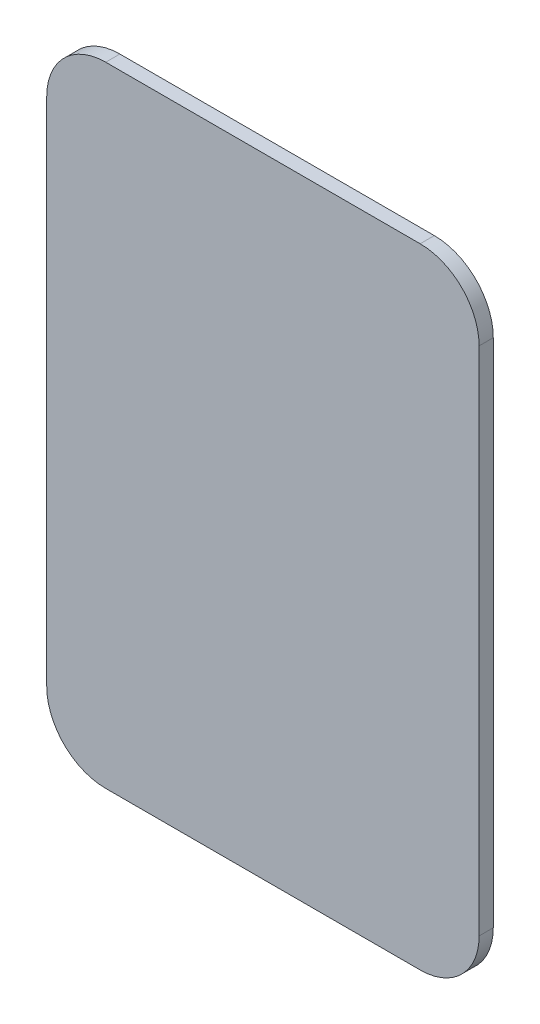
ISO-10303-21;
HEADER;
FILE_DESCRIPTION(('STEP AP214'),'2;1');
FILE_NAME('part.step','',(''),(''),'','','');
FILE_SCHEMA(('AUTOMOTIVE_DESIGN { 1 0 10303 214 1 1 1 1 }'));
ENDSEC;
DATA;
#1=APPLICATION_CONTEXT('core data for automotive mechanical design processes');
#2=APPLICATION_PROTOCOL_DEFINITION('international standard','automotive_design',2000,#1);
#3=PRODUCT_CONTEXT('',#1,'mechanical');
#4=PRODUCT('Part','Part','',(#3));
#5=PRODUCT_RELATED_PRODUCT_CATEGORY('part','',(#4));
#6=PRODUCT_DEFINITION_FORMATION('','',#4);
#7=PRODUCT_DEFINITION_CONTEXT('part definition',#1,'design');
#8=PRODUCT_DEFINITION('design','',#6,#7);
#9=PRODUCT_DEFINITION_SHAPE('','',#8);
#10=(LENGTH_UNIT() NAMED_UNIT(*) SI_UNIT(.MILLI.,.METRE.));
#11=(NAMED_UNIT(*) PLANE_ANGLE_UNIT() SI_UNIT($,.RADIAN.));
#12=(NAMED_UNIT(*) SI_UNIT($,.STERADIAN.) SOLID_ANGLE_UNIT());
#13=UNCERTAINTY_MEASURE_WITH_UNIT(LENGTH_MEASURE(1.E-05),#10,'distance_accuracy_value','');
#14=(GEOMETRIC_REPRESENTATION_CONTEXT(3) GLOBAL_UNCERTAINTY_ASSIGNED_CONTEXT((#13)) GLOBAL_UNIT_ASSIGNED_CONTEXT((#10,
#11,#12)) REPRESENTATION_CONTEXT('',''));
#15=CARTESIAN_POINT('',(0.,0.,0.));
#16=DIRECTION('',(0.,0.,1.));
#17=DIRECTION('',(1.,0.,0.));
#18=AXIS2_PLACEMENT_3D('',#15,#16,#17);
#19=CARTESIAN_POINT('',(177.8,889.,18.288));
#20=DIRECTION('',(0.,0.,-1.));
#21=DIRECTION('',(-1.,0.,0.));
#22=AXIS2_PLACEMENT_3D('',#19,#20,#21);
#23=CYLINDRICAL_SURFACE('',#22,76.2000000000001);
#24=CARTESIAN_POINT('',(177.8,889.,0.));
#25=DIRECTION('',(0.,0.,1.));
#26=DIRECTION('',(1.,0.,0.));
#27=AXIS2_PLACEMENT_3D('',#24,#25,#26);
#28=CIRCLE('',#27,76.2000000000001);
#29=CARTESIAN_POINT('',(101.6,889.,0.));
#30=VERTEX_POINT('',#29);
#31=CARTESIAN_POINT('',(177.8,812.8,0.));
#32=VERTEX_POINT('',#31);
#33=EDGE_CURVE('E128',#30,#32,#28,.T.);
#34=ORIENTED_EDGE('',*,*,#33,.T.);
#35=DIRECTION('',(0.,0.,-1.));
#36=VECTOR('',#35,1.);
#37=CARTESIAN_POINT('',(177.8,812.8,18.288));
#38=LINE('',#37,#36);
#39=CARTESIAN_POINT('',(177.8,812.8,18.288));
#40=VERTEX_POINT('',#39);
#41=EDGE_CURVE('E11',#40,#32,#38,.T.);
#42=ORIENTED_EDGE('',*,*,#41,.F.);
#43=CARTESIAN_POINT('',(177.8,889.,18.288));
#44=DIRECTION('',(0.,0.,1.));
#45=DIRECTION('',(1.,0.,0.));
#46=AXIS2_PLACEMENT_3D('',#43,#44,#45);
#47=CIRCLE('',#46,76.2000000000001);
#48=CARTESIAN_POINT('',(101.6,889.,18.288));
#49=VERTEX_POINT('',#48);
#50=EDGE_CURVE('E142',#49,#40,#47,.T.);
#51=ORIENTED_EDGE('',*,*,#50,.F.);
#52=DIRECTION('',(0.,0.,-1.));
#53=VECTOR('',#52,1.);
#54=CARTESIAN_POINT('',(101.6,889.,18.288));
#55=LINE('',#54,#53);
#56=EDGE_CURVE('E124',#49,#30,#55,.T.);
#57=ORIENTED_EDGE('',*,*,#56,.T.);
#58=EDGE_LOOP('',(#34,#42,#51,#57));
#59=FACE_BOUND('',#58,.T.);
#60=ADVANCED_FACE('F32',(#59),#23,.T.);
#61=CARTESIAN_POINT('',(177.8,812.8,18.288));
#62=DIRECTION('',(0.,1.,0.));
#63=DIRECTION('',(0.,0.,1.));
#64=AXIS2_PLACEMENT_3D('',#61,#62,#63);
#65=PLANE('',#64);
#66=DIRECTION('',(1.,0.,0.));
#67=VECTOR('',#66,1.);
#68=CARTESIAN_POINT('',(177.8,812.8,0.));
#69=LINE('',#68,#67);
#70=CARTESIAN_POINT('',(584.2,812.8,0.));
#71=VERTEX_POINT('',#70);
#72=EDGE_CURVE('E131',#32,#71,#69,.T.);
#73=ORIENTED_EDGE('',*,*,#72,.T.);
#74=DIRECTION('',(0.,0.,-1.));
#75=VECTOR('',#74,1.);
#76=CARTESIAN_POINT('',(584.2,812.8,18.288));
#77=LINE('',#76,#75);
#78=CARTESIAN_POINT('',(584.2,812.8,18.288));
#79=VERTEX_POINT('',#78);
#80=EDGE_CURVE('E40',#79,#71,#77,.T.);
#81=ORIENTED_EDGE('',*,*,#80,.F.);
#82=DIRECTION('',(1.,0.,0.));
#83=VECTOR('',#82,1.);
#84=CARTESIAN_POINT('',(177.8,812.8,18.288));
#85=LINE('',#84,#83);
#86=EDGE_CURVE('E91',#40,#79,#85,.T.);
#87=ORIENTED_EDGE('',*,*,#86,.F.);
#88=ORIENTED_EDGE('',*,*,#41,.T.);
#89=EDGE_LOOP('',(#73,#81,#87,#88));
#90=FACE_BOUND('',#89,.T.);
#91=ADVANCED_FACE('F177',(#90),#65,.F.);
#92=CARTESIAN_POINT('',(584.2,889.,18.288));
#93=DIRECTION('',(0.,0.,-1.));
#94=DIRECTION('',(-1.,0.,0.));
#95=AXIS2_PLACEMENT_3D('',#92,#93,#94);
#96=CYLINDRICAL_SURFACE('',#95,76.1999999999998);
#97=CARTESIAN_POINT('',(584.2,889.,0.));
#98=DIRECTION('',(0.,0.,1.));
#99=DIRECTION('',(1.,0.,0.));
#100=AXIS2_PLACEMENT_3D('',#97,#98,#99);
#101=CIRCLE('',#100,76.1999999999998);
#102=CARTESIAN_POINT('',(660.4,889.,0.));
#103=VERTEX_POINT('',#102);
#104=EDGE_CURVE('E133',#71,#103,#101,.T.);
#105=ORIENTED_EDGE('',*,*,#104,.T.);
#106=DIRECTION('',(0.,0.,-1.));
#107=VECTOR('',#106,1.);
#108=CARTESIAN_POINT('',(660.4,889.,18.288));
#109=LINE('',#108,#107);
#110=CARTESIAN_POINT('',(660.4,889.,18.288));
#111=VERTEX_POINT('',#110);
#112=EDGE_CURVE('E149',#111,#103,#109,.T.);
#113=ORIENTED_EDGE('',*,*,#112,.F.);
#114=CARTESIAN_POINT('',(584.2,889.,18.288));
#115=DIRECTION('',(0.,0.,1.));
#116=DIRECTION('',(1.,0.,0.));
#117=AXIS2_PLACEMENT_3D('',#114,#115,#116);
#118=CIRCLE('',#117,76.1999999999998);
#119=EDGE_CURVE('E157',#79,#111,#118,.T.);
#120=ORIENTED_EDGE('',*,*,#119,.F.);
#121=ORIENTED_EDGE('',*,*,#80,.T.);
#122=EDGE_LOOP('',(#105,#113,#120,#121));
#123=FACE_BOUND('',#122,.T.);
#124=ADVANCED_FACE('F155',(#123),#96,.T.);
#125=CARTESIAN_POINT('',(660.4,889.,18.288));
#126=DIRECTION('',(-1.,0.,0.));
#127=DIRECTION('',(0.,0.,1.));
#128=AXIS2_PLACEMENT_3D('',#125,#126,#127);
#129=PLANE('',#128);
#130=DIRECTION('',(0.,1.,0.));
#131=VECTOR('',#130,1.);
#132=CARTESIAN_POINT('',(660.4,889.,0.));
#133=LINE('',#132,#131);
#134=CARTESIAN_POINT('',(660.4,1549.4,0.));
#135=VERTEX_POINT('',#134);
#136=EDGE_CURVE('E135',#103,#135,#133,.T.);
#137=ORIENTED_EDGE('',*,*,#136,.T.);
#138=DIRECTION('',(0.,0.,-1.));
#139=VECTOR('',#138,1.);
#140=CARTESIAN_POINT('',(660.4,1549.4,18.288));
#141=LINE('',#140,#139);
#142=CARTESIAN_POINT('',(660.4,1549.4,18.288));
#143=VERTEX_POINT('',#142);
#144=EDGE_CURVE('E146',#143,#135,#141,.T.);
#145=ORIENTED_EDGE('',*,*,#144,.F.);
#146=DIRECTION('',(0.,1.,0.));
#147=VECTOR('',#146,1.);
#148=CARTESIAN_POINT('',(660.4,889.,18.288));
#149=LINE('',#148,#147);
#150=EDGE_CURVE('E169',#111,#143,#149,.T.);
#151=ORIENTED_EDGE('',*,*,#150,.F.);
#152=ORIENTED_EDGE('',*,*,#112,.T.);
#153=EDGE_LOOP('',(#137,#145,#151,#152));
#154=FACE_BOUND('',#153,.T.);
#155=ADVANCED_FACE('F165',(#154),#129,.F.);
#156=CARTESIAN_POINT('',(584.199999999999,1549.4,18.288));
#157=DIRECTION('',(0.,0.,-1.));
#158=DIRECTION('',(-1.,0.,0.));
#159=AXIS2_PLACEMENT_3D('',#156,#157,#158);
#160=CYLINDRICAL_SURFACE('',#159,76.2000000000005);
#161=CARTESIAN_POINT('',(584.199999999999,1549.4,0.));
#162=DIRECTION('',(0.,0.,1.));
#163=DIRECTION('',(1.,0.,0.));
#164=AXIS2_PLACEMENT_3D('',#161,#162,#163);
#165=CIRCLE('',#164,76.2000000000005);
#166=CARTESIAN_POINT('',(584.2,1625.6,0.));
#167=VERTEX_POINT('',#166);
#168=EDGE_CURVE('E137',#135,#167,#165,.T.);
#169=ORIENTED_EDGE('',*,*,#168,.T.);
#170=DIRECTION('',(0.,0.,-1.));
#171=VECTOR('',#170,1.);
#172=CARTESIAN_POINT('',(584.2,1625.6,18.288));
#173=LINE('',#172,#171);
#174=CARTESIAN_POINT('',(584.2,1625.6,18.288));
#175=VERTEX_POINT('',#174);
#176=EDGE_CURVE('E119',#175,#167,#173,.T.);
#177=ORIENTED_EDGE('',*,*,#176,.F.);
#178=CARTESIAN_POINT('',(584.199999999999,1549.4,18.288));
#179=DIRECTION('',(0.,0.,1.));
#180=DIRECTION('',(1.,0.,0.));
#181=AXIS2_PLACEMENT_3D('',#178,#179,#180);
#182=CIRCLE('',#181,76.2000000000005);
#183=EDGE_CURVE('E110',#143,#175,#182,.T.);
#184=ORIENTED_EDGE('',*,*,#183,.F.);
#185=ORIENTED_EDGE('',*,*,#144,.T.);
#186=EDGE_LOOP('',(#169,#177,#184,#185));
#187=FACE_BOUND('',#186,.T.);
#188=ADVANCED_FACE('F168',(#187),#160,.T.);
#189=CARTESIAN_POINT('',(584.2,1625.6,18.288));
#190=DIRECTION('',(0.,-1.,0.));
#191=DIRECTION('',(0.,0.,-1.));
#192=AXIS2_PLACEMENT_3D('',#189,#190,#191);
#193=PLANE('',#192);
#194=DIRECTION('',(-1.,0.,0.));
#195=VECTOR('',#194,1.);
#196=CARTESIAN_POINT('',(584.2,1625.6,0.));
#197=LINE('',#196,#195);
#198=CARTESIAN_POINT('',(177.8,1625.6,0.));
#199=VERTEX_POINT('',#198);
#200=EDGE_CURVE('E118',#167,#199,#197,.T.);
#201=ORIENTED_EDGE('',*,*,#200,.T.);
#202=DIRECTION('',(0.,0.,-1.));
#203=VECTOR('',#202,1.);
#204=CARTESIAN_POINT('',(177.8,1625.6,18.288));
#205=LINE('',#204,#203);
#206=CARTESIAN_POINT('',(177.8,1625.6,18.288));
#207=VERTEX_POINT('',#206);
#208=EDGE_CURVE('E115',#207,#199,#205,.T.);
#209=ORIENTED_EDGE('',*,*,#208,.F.);
#210=DIRECTION('',(-1.,0.,0.));
#211=VECTOR('',#210,1.);
#212=CARTESIAN_POINT('',(584.2,1625.6,18.288));
#213=LINE('',#212,#211);
#214=EDGE_CURVE('E104',#175,#207,#213,.T.);
#215=ORIENTED_EDGE('',*,*,#214,.F.);
#216=ORIENTED_EDGE('',*,*,#176,.T.);
#217=EDGE_LOOP('',(#201,#209,#215,#216));
#218=FACE_BOUND('',#217,.T.);
#219=ADVANCED_FACE('F116',(#218),#193,.F.);
#220=CARTESIAN_POINT('',(177.800000000001,1549.4,18.288));
#221=DIRECTION('',(0.,0.,-1.));
#222=DIRECTION('',(-1.,0.,0.));
#223=AXIS2_PLACEMENT_3D('',#220,#221,#222);
#224=CYLINDRICAL_SURFACE('',#223,76.2000000000007);
#225=CARTESIAN_POINT('',(177.800000000001,1549.4,0.));
#226=DIRECTION('',(0.,0.,1.));
#227=DIRECTION('',(1.,0.,0.));
#228=AXIS2_PLACEMENT_3D('',#225,#226,#227);
#229=CIRCLE('',#228,76.2000000000007);
#230=CARTESIAN_POINT('',(101.6,1549.4,0.));
#231=VERTEX_POINT('',#230);
#232=EDGE_CURVE('E77',#199,#231,#229,.T.);
#233=ORIENTED_EDGE('',*,*,#232,.T.);
#234=DIRECTION('',(0.,0.,-1.));
#235=VECTOR('',#234,1.);
#236=CARTESIAN_POINT('',(101.6,1549.4,18.288));
#237=LINE('',#236,#235);
#238=CARTESIAN_POINT('',(101.6,1549.4,18.288));
#239=VERTEX_POINT('',#238);
#240=EDGE_CURVE('E120',#239,#231,#237,.T.);
#241=ORIENTED_EDGE('',*,*,#240,.F.);
#242=CARTESIAN_POINT('',(177.800000000001,1549.4,18.288));
#243=DIRECTION('',(0.,0.,1.));
#244=DIRECTION('',(1.,0.,0.));
#245=AXIS2_PLACEMENT_3D('',#242,#243,#244);
#246=CIRCLE('',#245,76.2000000000007);
#247=EDGE_CURVE('E108',#207,#239,#246,.T.);
#248=ORIENTED_EDGE('',*,*,#247,.F.);
#249=ORIENTED_EDGE('',*,*,#208,.T.);
#250=EDGE_LOOP('',(#233,#241,#248,#249));
#251=FACE_BOUND('',#250,.T.);
#252=ADVANCED_FACE('F122',(#251),#224,.T.);
#253=CARTESIAN_POINT('',(101.6,1549.4,18.288));
#254=DIRECTION('',(1.,0.,0.));
#255=DIRECTION('',(0.,0.,-1.));
#256=AXIS2_PLACEMENT_3D('',#253,#254,#255);
#257=PLANE('',#256);
#258=DIRECTION('',(0.,-1.,0.));
#259=VECTOR('',#258,1.);
#260=CARTESIAN_POINT('',(101.6,1549.4,0.));
#261=LINE('',#260,#259);
#262=EDGE_CURVE('E83',#231,#30,#261,.T.);
#263=ORIENTED_EDGE('',*,*,#262,.T.);
#264=ORIENTED_EDGE('',*,*,#56,.F.);
#265=DIRECTION('',(0.,-1.,0.));
#266=VECTOR('',#265,1.);
#267=CARTESIAN_POINT('',(101.6,1549.4,18.288));
#268=LINE('',#267,#266);
#269=EDGE_CURVE('E48',#239,#49,#268,.T.);
#270=ORIENTED_EDGE('',*,*,#269,.F.);
#271=ORIENTED_EDGE('',*,*,#240,.T.);
#272=EDGE_LOOP('',(#263,#264,#270,#271));
#273=FACE_BOUND('',#272,.T.);
#274=ADVANCED_FACE('F193',(#273),#257,.F.);
#275=CARTESIAN_POINT('',(177.8,889.,18.288));
#276=DIRECTION('',(0.,0.,1.));
#277=DIRECTION('',(1.,0.,0.));
#278=AXIS2_PLACEMENT_3D('',#275,#276,#277);
#279=PLANE('',#278);
#280=ORIENTED_EDGE('',*,*,#50,.T.);
#281=ORIENTED_EDGE('',*,*,#86,.T.);
#282=ORIENTED_EDGE('',*,*,#119,.T.);
#283=ORIENTED_EDGE('',*,*,#150,.T.);
#284=ORIENTED_EDGE('',*,*,#183,.T.);
#285=ORIENTED_EDGE('',*,*,#214,.T.);
#286=ORIENTED_EDGE('',*,*,#247,.T.);
#287=ORIENTED_EDGE('',*,*,#269,.T.);
#288=EDGE_LOOP('',(#280,#281,#282,#283,#284,#285,#286,#287));
#289=FACE_BOUND('',#288,.T.);
#290=ADVANCED_FACE('F106',(#289),#279,.T.);
#291=CARTESIAN_POINT('',(177.8,889.,0.));
#292=DIRECTION('',(0.,0.,1.));
#293=DIRECTION('',(1.,0.,0.));
#294=AXIS2_PLACEMENT_3D('',#291,#292,#293);
#295=PLANE('',#294);
#296=ORIENTED_EDGE('',*,*,#33,.F.);
#297=ORIENTED_EDGE('',*,*,#262,.F.);
#298=ORIENTED_EDGE('',*,*,#232,.F.);
#299=ORIENTED_EDGE('',*,*,#200,.F.);
#300=ORIENTED_EDGE('',*,*,#168,.F.);
#301=ORIENTED_EDGE('',*,*,#136,.F.);
#302=ORIENTED_EDGE('',*,*,#104,.F.);
#303=ORIENTED_EDGE('',*,*,#72,.F.);
#304=EDGE_LOOP('',(#296,#297,#298,#299,#300,#301,#302,#303));
#305=FACE_BOUND('',#304,.T.);
#306=ADVANCED_FACE('F161',(#305),#295,.F.);
#307=CLOSED_SHELL('',(#60,#91,#124,#155,#188,#219,#252,#274,#290,#306));
#308=MANIFOLD_SOLID_BREP('B2',#307);
#309=ADVANCED_BREP_SHAPE_REPRESENTATION('',(#18,#308),#14);
#310=SHAPE_DEFINITION_REPRESENTATION(#9,#309);
ENDSEC;
END-ISO-10303-21;
